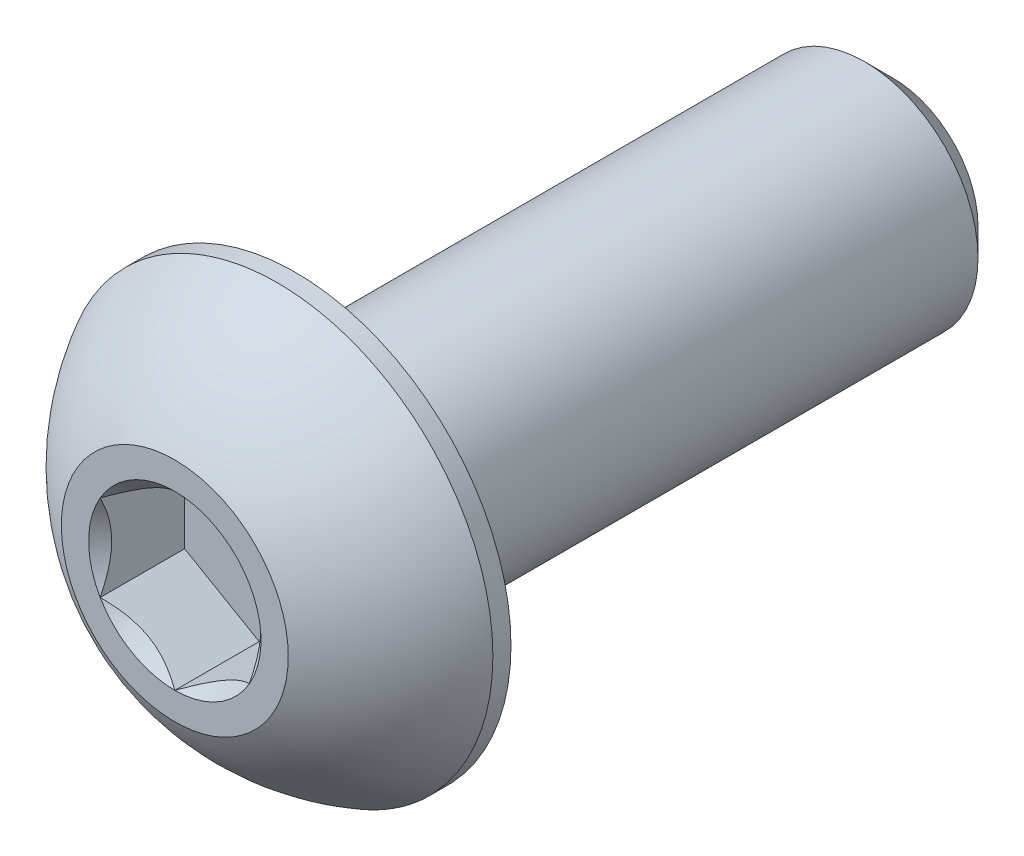
ISO-10303-21;
HEADER;
FILE_DESCRIPTION(('STEP AP214'),'2;1');
FILE_NAME('part.step','',(''),(''),'','','');
FILE_SCHEMA(('AUTOMOTIVE_DESIGN { 1 0 10303 214 1 1 1 1 }'));
ENDSEC;
DATA;
#1=APPLICATION_CONTEXT('core data for automotive mechanical design processes');
#2=APPLICATION_PROTOCOL_DEFINITION('international standard','automotive_design',2000,#1);
#3=PRODUCT_CONTEXT('',#1,'mechanical');
#4=PRODUCT('Part','Part','',(#3));
#5=PRODUCT_RELATED_PRODUCT_CATEGORY('part','',(#4));
#6=PRODUCT_DEFINITION_FORMATION('','',#4);
#7=PRODUCT_DEFINITION_CONTEXT('part definition',#1,'design');
#8=PRODUCT_DEFINITION('design','',#6,#7);
#9=PRODUCT_DEFINITION_SHAPE('','',#8);
#10=(LENGTH_UNIT() NAMED_UNIT(*) SI_UNIT(.MILLI.,.METRE.));
#11=(NAMED_UNIT(*) PLANE_ANGLE_UNIT() SI_UNIT($,.RADIAN.));
#12=(NAMED_UNIT(*) SI_UNIT($,.STERADIAN.) SOLID_ANGLE_UNIT());
#13=UNCERTAINTY_MEASURE_WITH_UNIT(LENGTH_MEASURE(1.E-05),#10,'distance_accuracy_value','');
#14=(GEOMETRIC_REPRESENTATION_CONTEXT(3) GLOBAL_UNCERTAINTY_ASSIGNED_CONTEXT((#13)) GLOBAL_UNIT_ASSIGNED_CONTEXT((#10,
#11,#12)) REPRESENTATION_CONTEXT('',''));
#15=CARTESIAN_POINT('',(0.,0.,0.));
#16=DIRECTION('',(0.,0.,1.));
#17=DIRECTION('',(1.,0.,0.));
#18=AXIS2_PLACEMENT_3D('',#15,#16,#17);
#19=CARTESIAN_POINT('',(1.5875,-0.91654355233853,-1.79578));
#20=DIRECTION('',(1.,0.,0.));
#21=DIRECTION('',(0.,0.,-1.));
#22=AXIS2_PLACEMENT_3D('',#19,#20,#21);
#23=PLANE('',#22);
#24=CARTESIAN_POINT('',(1.5875,0.916543552350696,-4.5148160186422E-11));
#25=CARTESIAN_POINT('',(1.5875,0.853951042749501,-0.0312670531094748));
#26=CARTESIAN_POINT('',(1.5875,0.790318655182352,-0.0607084185325689));
#27=CARTESIAN_POINT('',(1.5875,0.660541633657406,-0.114675036009975));
#28=CARTESIAN_POINT('',(1.5875,0.594383506068262,-0.139167551527056));
#29=CARTESIAN_POINT('',(1.5875,0.460155167710008,-0.181460861757153));
#30=CARTESIAN_POINT('',(1.5875,0.392092287368856,-0.199284303379211));
#31=CARTESIAN_POINT('',(1.5875,0.25447447299835,-0.226724262258425));
#32=CARTESIAN_POINT('',(1.5875,0.184924844084941,-0.23636615820705));
#33=CARTESIAN_POINT('',(1.5875,0.0959348173027102,-0.242807117936028));
#34=CARTESIAN_POINT('',(1.5875,0.0767574755188691,-0.243848419588411));
#35=CARTESIAN_POINT('',(1.5875,0.0383876515905482,-0.245238539012701));
#36=CARTESIAN_POINT('',(1.5875,0.0191951833459475,-0.245587732962164));
#37=CARTESIAN_POINT('',(1.5875,-0.04817613738867,-0.245585527984756));
#38=CARTESIAN_POINT('',(1.5875,-0.0963693775085044,-0.243380381653055));
#39=CARTESIAN_POINT('',(1.5875,-0.19237997675968,-0.234690759054081));
#40=CARTESIAN_POINT('',(1.5875,-0.240197050167174,-0.22820329805671));
#41=CARTESIAN_POINT('',(1.5875,-0.383011002180377,-0.202723016482505));
#42=CARTESIAN_POINT('',(1.5875,-0.476967063071653,-0.177716619167796));
#43=CARTESIAN_POINT('',(1.5875,-0.628737189875188,-0.12655997132136));
#44=CARTESIAN_POINT('',(1.5875,-0.687787687831008,-0.103812337902688));
#45=CARTESIAN_POINT('',(1.5875,-0.80365276412062,-0.0545108768258671));
#46=CARTESIAN_POINT('',(1.5875,-0.860482853236759,-0.0279937656188529));
#47=CARTESIAN_POINT('',(1.5875,-0.916543552350696,-4.51483131680501E-11));
#48=B_SPLINE_CURVE_WITH_KNOTS('',3,(#24,#25,#26,#27,#28,#29,#30,#31,#32,#33,#34,#35,#36,#37,#38,
#39,#40,#41,#42,#43,#44,#45,#46,#47),.UNSPECIFIED.,.F.,.F.,(4,2,2,2,2,2,2,2,2,2,2,4),(0.,
0.210047204138571,0.421441388615704,0.632111059443719,0.842124830787817,0.899732953406839,
0.957309755998791,1.10181621379492,1.246423497634,1.53683268063418,1.72655304070107,
1.91453812064177),.UNSPECIFIED.);
#49=CARTESIAN_POINT('',(1.58750000000041,0.916543552338296,-5.09958482129803E-11));
#50=VERTEX_POINT('',#49);
#51=CARTESIAN_POINT('',(1.58750000000527,-0.916543552341572,-4.51486722899349E-11));
#52=VERTEX_POINT('',#51);
#53=EDGE_CURVE('E21',#50,#52,#48,.T.);
#54=ORIENTED_EDGE('',*,*,#53,.F.);
#55=DIRECTION('',(0.,0.,1.));
#56=VECTOR('',#55,1.);
#57=CARTESIAN_POINT('',(1.5875,0.916543552338531,-1.79578));
#58=LINE('',#57,#56);
#59=CARTESIAN_POINT('',(1.5875,0.916543552338531,-1.79578));
#60=VERTEX_POINT('',#59);
#61=EDGE_CURVE('E69',#50,#60,#58,.F.);
#62=ORIENTED_EDGE('',*,*,#61,.T.);
#63=DIRECTION('',(0.,1.,0.));
#64=VECTOR('',#63,1.);
#65=CARTESIAN_POINT('',(1.5875,-0.91654355233853,-1.79578));
#66=LINE('',#65,#64);
#67=CARTESIAN_POINT('',(1.5875,-0.91654355233853,-1.79578));
#68=VERTEX_POINT('',#67);
#69=EDGE_CURVE('E75',#68,#60,#66,.T.);
#70=ORIENTED_EDGE('',*,*,#69,.F.);
#71=DIRECTION('',(0.,0.,1.));
#72=VECTOR('',#71,1.);
#73=CARTESIAN_POINT('',(1.5875,-0.91654355233853,-1.79578));
#74=LINE('',#73,#72);
#75=EDGE_CURVE('E72',#68,#52,#74,.T.);
#76=ORIENTED_EDGE('',*,*,#75,.T.);
#77=EDGE_LOOP('',(#54,#62,#70,#76));
#78=FACE_BOUND('',#77,.T.);
#79=ADVANCED_FACE('F17',(#78),#23,.F.);
#80=CARTESIAN_POINT('',(1.5875,-0.91654355233853,-1.79578));
#81=DIRECTION('',(0.,0.,1.));
#82=DIRECTION('',(1.,0.,0.));
#83=AXIS2_PLACEMENT_3D('',#80,#81,#82);
#84=PLANE('',#83);
#85=DIRECTION('',(0.,-1.,0.));
#86=VECTOR('',#85,1.);
#87=CARTESIAN_POINT('',(-1.5875,0.916543552338531,-1.79578));
#88=LINE('',#87,#86);
#89=CARTESIAN_POINT('',(-1.5875,0.91654355233853,-1.79578));
#90=VERTEX_POINT('',#89);
#91=CARTESIAN_POINT('',(-1.5875,-0.916543552338531,-1.79578));
#92=VERTEX_POINT('',#91);
#93=EDGE_CURVE('E218',#90,#92,#88,.T.);
#94=ORIENTED_EDGE('',*,*,#93,.T.);
#95=DIRECTION('',(0.866025403784439,-0.5,0.));
#96=VECTOR('',#95,1.);
#97=CARTESIAN_POINT('',(-1.5875,-0.916543552338531,-1.79578));
#98=LINE('',#97,#96);
#99=CARTESIAN_POINT('',(0.,-1.83308710467706,-1.79578));
#100=VERTEX_POINT('',#99);
#101=EDGE_CURVE('E244',#92,#100,#98,.T.);
#102=ORIENTED_EDGE('',*,*,#101,.T.);
#103=DIRECTION('',(0.866025403784438,0.5,0.));
#104=VECTOR('',#103,1.);
#105=CARTESIAN_POINT('',(0.,-1.83308710467706,-1.79578));
#106=LINE('',#105,#104);
#107=EDGE_CURVE('E233',#100,#68,#106,.T.);
#108=ORIENTED_EDGE('',*,*,#107,.T.);
#109=ORIENTED_EDGE('',*,*,#69,.T.);
#110=DIRECTION('',(-0.866025403784439,0.5,0.));
#111=VECTOR('',#110,1.);
#112=CARTESIAN_POINT('',(1.5875,0.916543552338531,-1.79578));
#113=LINE('',#112,#111);
#114=CARTESIAN_POINT('',(0.,1.83308710467706,-1.79578));
#115=VERTEX_POINT('',#114);
#116=EDGE_CURVE('E82',#60,#115,#113,.T.);
#117=ORIENTED_EDGE('',*,*,#116,.T.);
#118=DIRECTION('',(-0.866025403784438,-0.5,0.));
#119=VECTOR('',#118,1.);
#120=CARTESIAN_POINT('',(0.,1.83308710467706,-1.79578));
#121=LINE('',#120,#119);
#122=EDGE_CURVE('E83',#115,#90,#121,.T.);
#123=ORIENTED_EDGE('',*,*,#122,.T.);
#124=EDGE_LOOP('',(#94,#102,#108,#109,#117,#123));
#125=FACE_BOUND('',#124,.T.);
#126=ADVANCED_FACE('F162',(#125),#84,.T.);
#127=CARTESIAN_POINT('',(-1.5875,-0.916543552338531,-1.79578));
#128=DIRECTION('',(-0.5,-0.866025403784439,0.));
#129=DIRECTION('',(0.866025403784439,-0.5,0.));
#130=AXIS2_PLACEMENT_3D('',#127,#128,#129);
#131=PLANE('',#130);
#132=CARTESIAN_POINT('',(-1.58750000000813,-0.916543552333836,-4.65365177804234E-11));
#133=CARTESIAN_POINT('',(-1.53293684973442,-0.948045601832198,-0.0314718176892667));
#134=CARTESIAN_POINT('',(-1.47746140241271,-0.980074366276803,-0.0610949372672066));
#135=CARTESIAN_POINT('',(-1.36434127230903,-1.04538430384293,-0.115333604591992));
#136=CARTESIAN_POINT('',(-1.30668583767504,-1.07867168454911,-0.139918983823398));
#137=CARTESIAN_POINT('',(-1.1904264819008,-1.14579405490118,-0.18203390392943));
#138=CARTESIAN_POINT('',(-1.13185215255292,-1.17961195971778,-0.199669270496182));
#139=CARTESIAN_POINT('',(-1.01341433779326,-1.2479920639515,-0.226839911359059));
#140=CARTESIAN_POINT('',(-0.95355446788638,-1.28255217595589,-0.236395459908957));
#141=CARTESIAN_POINT('',(-0.850383225835588,-1.34211812032654,-0.245017258142065));
#142=CARTESIAN_POINT('',(-0.807205047661772,-1.36704705311831,-0.24629317825213));
#143=CARTESIAN_POINT('',(-0.720919334101995,-1.41686413306927,-0.244140862172588));
#144=CARTESIAN_POINT('',(-0.677811828778317,-1.44175226287199,-0.240710977134276));
#145=CARTESIAN_POINT('',(-0.592014799905288,-1.4912872005875,-0.22934368581992));
#146=CARTESIAN_POINT('',(-0.54932567052745,-1.51593378092527,-0.2214023797855));
#147=CARTESIAN_POINT('',(-0.464663949078726,-1.56481324859374,-0.2014437231592));
#148=CARTESIAN_POINT('',(-0.422691672575671,-1.58904595373128,-0.189424623694276));
#149=CARTESIAN_POINT('',(-0.315224720340997,-1.65109202753296,-0.153756168099754));
#150=CARTESIAN_POINT('',(-0.25039544383198,-1.68852122777681,-0.127422292452885));
#151=CARTESIAN_POINT('',(-0.155071115632602,-1.74355675432304,-0.0829693854516809));
#152=CARTESIAN_POINT('',(-0.12365879001164,-1.76169266897618,-0.0673516407383855));
#153=CARTESIAN_POINT('',(-0.0614115175424615,-1.79763114849258,-0.0346905494690997));
#154=CARTESIAN_POINT('',(-0.0305763044110986,-1.81543386709449,-0.0176478812714443));
#155=CARTESIAN_POINT('',(8.13171000505997E-12,-1.83308710468176,-4.65365727835881E-11));
#156=B_SPLINE_CURVE_WITH_KNOTS('',3,(#132,#133,#134,#135,#136,#137,#138,#139,#140,#141,#142,
#143,#144,#145,#146,#147,#148,#149,#150,#151,#152,#153,#154,#155),.UNSPECIFIED.,.F.,.F.,(4,2,2,
2,2,2,2,2,2,2,2,4),(0.,0.211427927731364,0.424087197146833,0.633370156420732,0.842126401513702,
0.991537201097076,1.14100036551936,1.29059292577182,1.44024972414901,1.67781721416321,
1.79627069410093,1.91466809994021),.UNSPECIFIED.);
#157=CARTESIAN_POINT('',(-1.58750000000164,-0.91654355233478,-5.16899840796238E-11));
#158=VERTEX_POINT('',#157);
#159=CARTESIAN_POINT('',(7.95488278334753E-13,-1.8330871046766,-5.1689793188624E-11));
#160=VERTEX_POINT('',#159);
#161=EDGE_CURVE('E164',#158,#160,#156,.T.);
#162=ORIENTED_EDGE('',*,*,#161,.T.);
#163=DIRECTION('',(0.,0.,1.));
#164=VECTOR('',#163,1.);
#165=CARTESIAN_POINT('',(0.,-1.83308710467706,-1.79578));
#166=LINE('',#165,#164);
#167=EDGE_CURVE('E227',#160,#100,#166,.F.);
#168=ORIENTED_EDGE('',*,*,#167,.T.);
#169=ORIENTED_EDGE('',*,*,#101,.F.);
#170=DIRECTION('',(0.,0.,1.));
#171=VECTOR('',#170,1.);
#172=CARTESIAN_POINT('',(-1.5875,-0.916543552338531,-1.79578));
#173=LINE('',#172,#171);
#174=EDGE_CURVE('E214',#92,#158,#173,.T.);
#175=ORIENTED_EDGE('',*,*,#174,.T.);
#176=EDGE_LOOP('',(#162,#168,#169,#175));
#177=FACE_BOUND('',#176,.T.);
#178=ADVANCED_FACE('F158',(#177),#131,.F.);
#179=CARTESIAN_POINT('',(0.,-1.83308710467706,-1.79578));
#180=DIRECTION('',(0.5,-0.866025403784438,0.));
#181=DIRECTION('',(0.866025403784438,0.5,0.));
#182=AXIS2_PLACEMENT_3D('',#179,#180,#181);
#183=PLANE('',#182);
#184=CARTESIAN_POINT('',(-8.13084748350422E-12,-1.83308710468176,-4.65361675164433E-11));
#185=CARTESIAN_POINT('',(0.0545631502655831,-1.80158505518339,-0.0314718176892672));
#186=CARTESIAN_POINT('',(0.110038597587296,-1.76955629073879,-0.0610949372672078));
#187=CARTESIAN_POINT('',(0.22315872769098,-1.70424635317266,-0.115333604591995));
#188=CARTESIAN_POINT('',(0.280814162324968,-1.67095897246648,-0.1399189838234));
#189=CARTESIAN_POINT('',(0.397073518099212,-1.60383660211441,-0.182033903929432));
#190=CARTESIAN_POINT('',(0.455647847447088,-1.57001869729781,-0.199669270496184));
#191=CARTESIAN_POINT('',(0.574085662206744,-1.50163859306409,-0.226839911359059));
#192=CARTESIAN_POINT('',(0.633945532113621,-1.4670784810597,-0.236395459908957));
#193=CARTESIAN_POINT('',(0.737116774164411,-1.40751253668905,-0.245017258142065));
#194=CARTESIAN_POINT('',(0.780294952338226,-1.38258360389728,-0.24629317825213));
#195=CARTESIAN_POINT('',(0.866580665898003,-1.33276652394632,-0.244140862172588));
#196=CARTESIAN_POINT('',(0.90968817122168,-1.30787839414361,-0.240710977134277));
#197=CARTESIAN_POINT('',(0.995485200094709,-1.25834345642809,-0.229343685819921));
#198=CARTESIAN_POINT('',(1.03817432947255,-1.23369687609033,-0.2214023797855));
#199=CARTESIAN_POINT('',(1.12283605092127,-1.18481740842185,-0.2014437231592));
#200=CARTESIAN_POINT('',(1.16480832742433,-1.16058470328431,-0.189424623694276));
#201=CARTESIAN_POINT('',(1.27227527965931,-1.09853862948245,-0.153756168099651));
#202=CARTESIAN_POINT('',(1.33710455616863,-1.06110942923843,-0.127422292452638));
#203=CARTESIAN_POINT('',(1.43242888436844,-1.00607390269195,-0.0829693854511779));
#204=CARTESIAN_POINT('',(1.46384120998954,-0.987937988038733,-0.0673516407377908));
#205=CARTESIAN_POINT('',(1.52608848245899,-0.951999508522174,-0.0346905494683118));
#206=CARTESIAN_POINT('',(1.55692369559049,-0.934196789920184,-0.0176478812705549));
#207=CARTESIAN_POINT('',(1.58750000000985,-0.916543552332841,-4.55419445064032E-11));
#208=B_SPLINE_CURVE_WITH_KNOTS('',3,(#184,#185,#186,#187,#188,#189,#190,#191,#192,#193,#194,
#195,#196,#197,#198,#199,#200,#201,#202,#203,#204,#205,#206,#207),.UNSPECIFIED.,.F.,.F.,(4,2,2,
2,2,2,2,2,2,2,2,4),(0.,0.211427927731369,0.424087197146844,0.633370156420738,0.842126401513702,
0.991537201097074,1.14100036551936,1.29059292577182,1.44024972414901,1.67781721416432,
1.7962706941026,1.91466809994243),.UNSPECIFIED.);
#209=EDGE_CURVE('E92',#160,#52,#208,.T.);
#210=ORIENTED_EDGE('',*,*,#209,.T.);
#211=ORIENTED_EDGE('',*,*,#75,.F.);
#212=ORIENTED_EDGE('',*,*,#107,.F.);
#213=ORIENTED_EDGE('',*,*,#167,.F.);
#214=EDGE_LOOP('',(#210,#211,#212,#213));
#215=FACE_BOUND('',#214,.T.);
#216=ADVANCED_FACE('F153',(#215),#183,.F.);
#217=CARTESIAN_POINT('',(1.5875,0.916543552338531,-1.79578));
#218=DIRECTION('',(0.5,0.866025403784439,0.));
#219=DIRECTION('',(-0.866025403784439,0.5,0.));
#220=AXIS2_PLACEMENT_3D('',#217,#218,#219);
#221=PLANE('',#220);
#222=CARTESIAN_POINT('',(1.58750000000388,0.916543552325157,-4.09205335444077E-11));
#223=CARTESIAN_POINT('',(1.53293684973449,0.948045601828149,-0.0314718176863875));
#224=CARTESIAN_POINT('',(1.47746140241465,0.980074366274606,-0.0610949372654595));
#225=CARTESIAN_POINT('',(1.3643412723126,1.04538430384195,-0.1153336045911));
#226=CARTESIAN_POINT('',(1.30668583767836,1.07867168454748,-0.139918983822225));
#227=CARTESIAN_POINT('',(1.19042648190426,1.1457940548989,-0.182033903928146));
#228=CARTESIAN_POINT('',(1.13185215255677,1.17961195971548,-0.199669270495064));
#229=CARTESIAN_POINT('',(1.01341433779771,1.247992063949,-0.226839911358272));
#230=CARTESIAN_POINT('',(0.953554467891033,1.28255217595322,-0.236395459908332));
#231=CARTESIAN_POINT('',(0.85038322584057,1.34211812032365,-0.245017258141818));
#232=CARTESIAN_POINT('',(0.807205047666872,1.36704705311536,-0.246293178252067));
#233=CARTESIAN_POINT('',(0.720919334107315,1.4168641330662,-0.24414086217291));
#234=CARTESIAN_POINT('',(0.677811828783741,1.44175226286886,-0.240710977134801));
#235=CARTESIAN_POINT('',(0.592014799910885,1.49128720058427,-0.229343685820857));
#236=CARTESIAN_POINT('',(0.549325670533118,1.51593378092199,-0.221402379786645));
#237=CARTESIAN_POINT('',(0.464663949084521,1.5648132485904,-0.201443723160757));
#238=CARTESIAN_POINT('',(0.422691672581523,1.58904595372791,-0.189424623696037));
#239=CARTESIAN_POINT('',(0.315224720345838,1.65109202753017,-0.153756168101648));
#240=CARTESIAN_POINT('',(0.250395443835785,1.68852122777462,-0.127422292454545));
#241=CARTESIAN_POINT('',(0.155071115634923,1.7435567543217,-0.0829693854528209));
#242=CARTESIAN_POINT('',(0.123658790013484,1.76169266897511,-0.0673516407393276));
#243=CARTESIAN_POINT('',(0.0614115175433705,1.79763114849205,-0.0346905494696016));
#244=CARTESIAN_POINT('',(0.0305763044115495,1.81543386709423,-0.0176478812717039));
#245=CARTESIAN_POINT('',(-8.13179444088293E-12,1.83308710468176,-4.65362862267458E-11));
#246=B_SPLINE_CURVE_WITH_KNOTS('',3,(#222,#223,#224,#225,#226,#227,#228,#229,#230,#231,#232,
#233,#234,#235,#236,#237,#238,#239,#240,#241,#242,#243,#244,#245),.UNSPECIFIED.,.F.,.F.,(4,2,2,
2,2,2,2,2,2,2,2,4),(0.,0.211427927730897,0.424087197145704,0.633370156418781,0.842126401511014,
0.991537201094014,1.1410003655159,1.29059292576802,1.44024972414487,1.67781721416266,
1.79627069410213,1.91466809994315),.UNSPECIFIED.);
#247=CARTESIAN_POINT('',(-7.95207176848919E-13,1.8330871046766,-5.16898686531374E-11));
#248=VERTEX_POINT('',#247);
#249=EDGE_CURVE('E80',#50,#248,#246,.T.);
#250=ORIENTED_EDGE('',*,*,#249,.T.);
#251=DIRECTION('',(0.,0.,1.));
#252=VECTOR('',#251,1.);
#253=CARTESIAN_POINT('',(0.,1.83308710467706,-1.79578));
#254=LINE('',#253,#252);
#255=EDGE_CURVE('E221',#248,#115,#254,.F.);
#256=ORIENTED_EDGE('',*,*,#255,.T.);
#257=ORIENTED_EDGE('',*,*,#116,.F.);
#258=ORIENTED_EDGE('',*,*,#61,.F.);
#259=EDGE_LOOP('',(#250,#256,#257,#258));
#260=FACE_BOUND('',#259,.T.);
#261=ADVANCED_FACE('F77',(#260),#221,.F.);
#262=CARTESIAN_POINT('',(0.,1.83308710467706,-1.79578));
#263=DIRECTION('',(-0.5,0.866025403784438,0.));
#264=DIRECTION('',(-0.866025403784438,-0.5,0.));
#265=AXIS2_PLACEMENT_3D('',#262,#263,#264);
#266=PLANE('',#265);
#267=CARTESIAN_POINT('',(8.13097600560689E-12,1.83308710468176,-4.65363184454702E-11));
#268=CARTESIAN_POINT('',(-0.0545631502655815,1.80158505518339,-0.0314718176892664));
#269=CARTESIAN_POINT('',(-0.110038597587293,1.76955629073879,-0.0610949372672063));
#270=CARTESIAN_POINT('',(-0.223158727690974,1.70424635317266,-0.115333604591992));
#271=CARTESIAN_POINT('',(-0.280814162324961,1.67095897246649,-0.139918983823398));
#272=CARTESIAN_POINT('',(-0.397073518099204,1.60383660211441,-0.18203390392943));
#273=CARTESIAN_POINT('',(-0.455647847447081,1.57001869729782,-0.199669270496182));
#274=CARTESIAN_POINT('',(-0.574085662206741,1.50163859306409,-0.226839911359059));
#275=CARTESIAN_POINT('',(-0.63394553211362,1.4670784810597,-0.236395459908958));
#276=CARTESIAN_POINT('',(-0.737116774164412,1.40751253668905,-0.245017258142065));
#277=CARTESIAN_POINT('',(-0.780294952338228,1.38258360389728,-0.24629317825213));
#278=CARTESIAN_POINT('',(-0.866580665898006,1.33276652394632,-0.244140862172588));
#279=CARTESIAN_POINT('',(-0.909688171221683,1.3078783941436,-0.240710977134277));
#280=CARTESIAN_POINT('',(-0.995485200094712,1.25834345642809,-0.22934368581992));
#281=CARTESIAN_POINT('',(-1.03817432947255,1.23369687609032,-0.2214023797855));
#282=CARTESIAN_POINT('',(-1.12283605092128,1.18481740842185,-0.2014437231592));
#283=CARTESIAN_POINT('',(-1.16480832742433,1.16058470328431,-0.189424623694275));
#284=CARTESIAN_POINT('',(-1.272275279659,1.09853862948263,-0.153756168099754));
#285=CARTESIAN_POINT('',(-1.33710455616802,1.06110942923878,-0.127422292452885));
#286=CARTESIAN_POINT('',(-1.4324288843674,1.00607390269255,-0.082969385451681));
#287=CARTESIAN_POINT('',(-1.46384120998836,0.987937988039414,-0.0673516407383855));
#288=CARTESIAN_POINT('',(-1.52608848245754,0.951999508523014,-0.0346905494690997));
#289=CARTESIAN_POINT('',(-1.5569236955889,0.934196789921102,-0.0176478812714444));
#290=CARTESIAN_POINT('',(-1.58750000000813,0.916543552333835,-4.65368165514551E-11));
#291=B_SPLINE_CURVE_WITH_KNOTS('',3,(#267,#268,#269,#270,#271,#272,#273,#274,#275,#276,#277,
#278,#279,#280,#281,#282,#283,#284,#285,#286,#287,#288,#289,#290),.UNSPECIFIED.,.F.,.F.,(4,2,2,
2,2,2,2,2,2,2,2,4),(0.,0.211427927731364,0.424087197146833,0.633370156420733,0.842126401513703,
0.991537201097077,1.14100036551936,1.29059292577183,1.44024972414901,1.67781721416321,
1.79627069410093,1.91466809994021),.UNSPECIFIED.);
#292=CARTESIAN_POINT('',(-1.5875,0.916543552337613,-5.16898734477398E-11));
#293=VERTEX_POINT('',#292);
#294=EDGE_CURVE('E40',#248,#293,#291,.T.);
#295=ORIENTED_EDGE('',*,*,#294,.T.);
#296=DIRECTION('',(0.,0.,1.));
#297=VECTOR('',#296,1.);
#298=CARTESIAN_POINT('',(-1.5875,0.916543552338531,-1.79578));
#299=LINE('',#298,#297);
#300=EDGE_CURVE('E168',#293,#90,#299,.F.);
#301=ORIENTED_EDGE('',*,*,#300,.T.);
#302=ORIENTED_EDGE('',*,*,#122,.F.);
#303=ORIENTED_EDGE('',*,*,#255,.F.);
#304=EDGE_LOOP('',(#295,#301,#302,#303));
#305=FACE_BOUND('',#304,.T.);
#306=ADVANCED_FACE('F152',(#305),#266,.F.);
#307=CARTESIAN_POINT('',(-1.5875,0.916543552338531,-1.79578));
#308=DIRECTION('',(-1.,0.,0.));
#309=DIRECTION('',(0.,-1.,0.));
#310=AXIS2_PLACEMENT_3D('',#307,#308,#309);
#311=PLANE('',#310);
#312=CARTESIAN_POINT('',(-1.5875,0.91654355234792,-4.65364617736849E-11));
#313=CARTESIAN_POINT('',(-1.5875,0.853539453351184,-0.0314718176892656));
#314=CARTESIAN_POINT('',(-1.5875,0.789481924461962,-0.0610949372672041));
#315=CARTESIAN_POINT('',(-1.5875,0.658862049329686,-0.115333604591986));
#316=CARTESIAN_POINT('',(-1.5875,0.59228728791732,-0.139918983823388));
#317=CARTESIAN_POINT('',(-1.5875,0.458042547213152,-0.182033903929413));
#318=CARTESIAN_POINT('',(-1.5875,0.390406737579943,-0.199669270496161));
#319=CARTESIAN_POINT('',(-1.5875,0.25364652911248,-0.226839911359028));
#320=CARTESIAN_POINT('',(-1.5875,0.184526305103684,-0.23639545990892));
#321=CARTESIAN_POINT('',(-1.5875,0.0653944163623529,-0.245017258142017));
#322=CARTESIAN_POINT('',(-1.5875,0.0155365507787979,-0.246293178252077));
#323=CARTESIAN_POINT('',(-1.5875,-0.0840976091231443,-0.244140862172523));
#324=CARTESIAN_POINT('',(-1.5875,-0.133873868728595,-0.240710977134206));
#325=CARTESIAN_POINT('',(-1.5875,-0.23294374415965,-0.229343685819835));
#326=CARTESIAN_POINT('',(-1.5875,-0.282236904835194,-0.221402379785407));
#327=CARTESIAN_POINT('',(-1.5875,-0.379995840172177,-0.20144372315909));
#328=CARTESIAN_POINT('',(-1.5875,-0.42846125044727,-0.189424623694157));
#329=CARTESIAN_POINT('',(-1.5875,-0.552553398050583,-0.153756168099635));
#330=CARTESIAN_POINT('',(-1.5875,-0.627411798538228,-0.127422292452783));
#331=CARTESIAN_POINT('',(-1.5875,-0.737482851630614,-0.0829693854516115));
#332=CARTESIAN_POINT('',(-1.5875,-0.773754680936858,-0.0673516407383284));
#333=CARTESIAN_POINT('',(-1.5875,-0.84563163996961,-0.0346905494690696));
#334=CARTESIAN_POINT('',(-1.5875,-0.88123707717341,-0.0176478812714289));
#335=CARTESIAN_POINT('',(-1.5875,-0.91654355234792,-4.65367892631301E-11));
#336=B_SPLINE_CURVE_WITH_KNOTS('',3,(#312,#313,#314,#315,#316,#317,#318,#319,#320,#321,#322,
#323,#324,#325,#326,#327,#328,#329,#330,#331,#332,#333,#334,#335),.UNSPECIFIED.,.F.,.F.,(4,2,2,
2,2,2,2,2,2,2,2,4),(0.,0.211427927731395,0.424087197146896,0.633370156420825,0.842126401513825,
0.991537201097242,1.14100036551957,1.29059292577208,1.44024972414931,1.67781721416334,
1.79627069410098,1.91466809994017),.UNSPECIFIED.);
#337=EDGE_CURVE('E109',#293,#158,#336,.T.);
#338=ORIENTED_EDGE('',*,*,#337,.T.);
#339=ORIENTED_EDGE('',*,*,#174,.F.);
#340=ORIENTED_EDGE('',*,*,#93,.F.);
#341=ORIENTED_EDGE('',*,*,#300,.F.);
#342=EDGE_LOOP('',(#338,#339,#340,#341));
#343=FACE_BOUND('',#342,.T.);
#344=ADVANCED_FACE('F122',(#343),#311,.F.);
#345=CARTESIAN_POINT('',(0.,0.,-5.6843418860808E-11));
#346=DIRECTION('',(0.,0.,1.));
#347=DIRECTION('',(1.,0.,0.));
#348=AXIS2_PLACEMENT_3D('',#345,#346,#347);
#349=CONICAL_SURFACE('',#348,1.83308710467145,0.78539816351237);
#350=ORIENTED_EDGE('',*,*,#161,.F.);
#351=CARTESIAN_POINT('',(0.,0.,-5.6843418860808E-11));
#352=DIRECTION('',(0.,0.,1.));
#353=DIRECTION('',(1.,0.,0.));
#354=AXIS2_PLACEMENT_3D('',#351,#352,#353);
#355=CIRCLE('',#354,1.83308710467145);
#356=EDGE_CURVE('E106',#158,#160,#355,.T.);
#357=ORIENTED_EDGE('',*,*,#356,.T.);
#358=EDGE_LOOP('',(#350,#357));
#359=FACE_BOUND('',#358,.T.);
#360=ADVANCED_FACE('F169',(#359),#349,.F.);
#361=CARTESIAN_POINT('',(0.,0.,-5.6843418860808E-11));
#362=DIRECTION('',(0.,0.,1.));
#363=DIRECTION('',(1.,0.,0.));
#364=AXIS2_PLACEMENT_3D('',#361,#362,#363);
#365=CONICAL_SURFACE('',#364,1.83308710467145,0.78539816351237);
#366=ORIENTED_EDGE('',*,*,#209,.F.);
#367=CARTESIAN_POINT('',(0.,0.,-5.6843418860808E-11));
#368=DIRECTION('',(0.,0.,1.));
#369=DIRECTION('',(1.,0.,0.));
#370=AXIS2_PLACEMENT_3D('',#367,#368,#369);
#371=CIRCLE('',#370,1.83308710467145);
#372=EDGE_CURVE('E87',#160,#52,#371,.T.);
#373=ORIENTED_EDGE('',*,*,#372,.T.);
#374=EDGE_LOOP('',(#366,#373));
#375=FACE_BOUND('',#374,.T.);
#376=ADVANCED_FACE('F172',(#375),#365,.F.);
#377=CARTESIAN_POINT('',(0.,0.,-5.6843418860808E-11));
#378=DIRECTION('',(0.,0.,1.));
#379=DIRECTION('',(1.,0.,0.));
#380=AXIS2_PLACEMENT_3D('',#377,#378,#379);
#381=CONICAL_SURFACE('',#380,1.83308710467145,0.785398163397448);
#382=CARTESIAN_POINT('',(0.,0.,-5.6843418860808E-11));
#383=DIRECTION('',(0.,0.,1.));
#384=DIRECTION('',(1.,0.,0.));
#385=AXIS2_PLACEMENT_3D('',#382,#383,#384);
#386=CIRCLE('',#385,1.83308710467145);
#387=EDGE_CURVE('E60',#52,#50,#386,.T.);
#388=ORIENTED_EDGE('',*,*,#387,.T.);
#389=ORIENTED_EDGE('',*,*,#53,.T.);
#390=EDGE_LOOP('',(#388,#389));
#391=FACE_BOUND('',#390,.T.);
#392=ADVANCED_FACE('F85',(#391),#381,.F.);
#393=CARTESIAN_POINT('',(0.,0.,-5.6843418860808E-11));
#394=DIRECTION('',(0.,0.,1.));
#395=DIRECTION('',(1.,0.,0.));
#396=AXIS2_PLACEMENT_3D('',#393,#394,#395);
#397=CONICAL_SURFACE('',#396,1.83308710467145,0.78539816351237);
#398=ORIENTED_EDGE('',*,*,#249,.F.);
#399=CARTESIAN_POINT('',(0.,0.,-5.6843418860808E-11));
#400=DIRECTION('',(0.,0.,1.));
#401=DIRECTION('',(1.,0.,0.));
#402=AXIS2_PLACEMENT_3D('',#399,#400,#401);
#403=CIRCLE('',#402,1.83308710467145);
#404=EDGE_CURVE('E86',#50,#248,#403,.T.);
#405=ORIENTED_EDGE('',*,*,#404,.T.);
#406=EDGE_LOOP('',(#398,#405));
#407=FACE_BOUND('',#406,.T.);
#408=ADVANCED_FACE('F91',(#407),#397,.F.);
#409=CARTESIAN_POINT('',(0.,0.,-5.6843418860808E-11));
#410=DIRECTION('',(0.,0.,1.));
#411=DIRECTION('',(1.,0.,0.));
#412=AXIS2_PLACEMENT_3D('',#409,#410,#411);
#413=CONICAL_SURFACE('',#412,1.83308710467145,0.78539816351237);
#414=ORIENTED_EDGE('',*,*,#294,.F.);
#415=CARTESIAN_POINT('',(0.,0.,-5.68432020203736E-11));
#416=DIRECTION('',(0.,0.,1.));
#417=DIRECTION('',(1.,0.,0.));
#418=AXIS2_PLACEMENT_3D('',#415,#416,#417);
#419=CIRCLE('',#418,1.83308710467145);
#420=EDGE_CURVE('E98',#248,#293,#419,.T.);
#421=ORIENTED_EDGE('',*,*,#420,.T.);
#422=EDGE_LOOP('',(#414,#421));
#423=FACE_BOUND('',#422,.T.);
#424=ADVANCED_FACE('F129',(#423),#413,.F.);
#425=CARTESIAN_POINT('',(0.,0.,-5.6843418860808E-11));
#426=DIRECTION('',(0.,0.,1.));
#427=DIRECTION('',(1.,0.,0.));
#428=AXIS2_PLACEMENT_3D('',#425,#426,#427);
#429=CONICAL_SURFACE('',#428,1.83308710467145,0.785398163512482);
#430=ORIENTED_EDGE('',*,*,#337,.F.);
#431=CARTESIAN_POINT('',(0.,0.,-5.6843418860808E-11));
#432=DIRECTION('',(0.,0.,1.));
#433=DIRECTION('',(1.,0.,0.));
#434=AXIS2_PLACEMENT_3D('',#431,#432,#433);
#435=CIRCLE('',#434,1.83308710467145);
#436=EDGE_CURVE('E100',#293,#158,#435,.T.);
#437=ORIENTED_EDGE('',*,*,#436,.T.);
#438=EDGE_LOOP('',(#430,#437));
#439=FACE_BOUND('',#438,.T.);
#440=ADVANCED_FACE('F125',(#439),#429,.F.);
#441=CARTESIAN_POINT('',(0.,-2.413,0.));
#442=DIRECTION('',(0.,0.,-1.));
#443=DIRECTION('',(-1.,0.,0.));
#444=AXIS2_PLACEMENT_3D('',#441,#442,#443);
#445=PLANE('',#444);
#446=CARTESIAN_POINT('',(0.,2.41300000000001,0.));
#447=CARTESIAN_POINT('',(0.0677494728281043,2.41299959399955,0.));
#448=CARTESIAN_POINT('',(0.13551139645195,2.41014415989588,0.));
#449=CARTESIAN_POINT('',(0.270566967352935,2.39874098782787,0.));
#450=CARTESIAN_POINT('',(0.337860470451762,2.39019156931712,-1.27847024027233E-13));
#451=CARTESIAN_POINT('',(0.471601320639727,2.36743889257111,1.28918507901389E-13));
#452=CARTESIAN_POINT('',(0.538047150928301,2.35322665951012,4.80959012476224E-13));
#453=CARTESIAN_POINT('',(0.669542290683469,2.31924632100677,-4.80482413021759E-13));
#454=CARTESIAN_POINT('',(0.734590420561955,2.29947370693801,-1.79531897556432E-12));
#455=CARTESIAN_POINT('',(0.926662950450337,2.23208866037698,-3.22584967757263E-12));
#456=CARTESIAN_POINT('',(1.05093873255639,2.17635367452114,-8.45786465533834E-13));
#457=CARTESIAN_POINT('',(1.28835543096987,2.04478110377478,8.46685999083916E-13));
#458=CARTESIAN_POINT('',(1.40149592376953,1.96894275469913,1.58978621376691E-13));
#459=CARTESIAN_POINT('',(1.56039704916752,1.84183425468125,0.));
#460=CARTESIAN_POINT('',(1.61159242186082,1.79720603297069,0.));
#461=CARTESIAN_POINT('',(1.71000632967643,1.70383063464741,0.));
#462=CARTESIAN_POINT('',(1.75722865147863,1.65508747081338,0.));
#463=CARTESIAN_POINT('',(1.84741983372678,1.55377296533884,0.));
#464=CARTESIAN_POINT('',(1.89038675770033,1.50119989956805,0.));
#465=CARTESIAN_POINT('',(1.97174331906875,1.3926258162236,0.));
#466=CARTESIAN_POINT('',(2.01013189400735,1.33662400751775,0.));
#467=CARTESIAN_POINT('',(2.11797602264298,1.16408610688379,0.));
#468=CARTESIAN_POINT('',(2.18020511880695,1.04291047052782,0.));
#469=CARTESIAN_POINT('',(2.28339851019844,0.791897051410366,0.));
#470=CARTESIAN_POINT('',(2.32436303254154,0.66205936118038,0.));
#471=CARTESIAN_POINT('',(2.38392374490441,0.397332738666662,0.));
#472=CARTESIAN_POINT('',(2.40251981546714,0.262443779410977,0.));
#473=CARTESIAN_POINT('',(2.41679648401006,-0.00854142496427087,0.));
#474=CARTESIAN_POINT('',(2.41247708199024,-0.144637670083833,0.));
#475=CARTESIAN_POINT('',(2.38106276220064,-0.414157249403837,0.));
#476=CARTESIAN_POINT('',(2.35396796606072,-0.547580597874736,0.));
#477=CARTESIAN_POINT('',(2.27772157192305,-0.808047678299337,0.));
#478=CARTESIAN_POINT('',(2.22856973834409,-0.935091342098402,0.));
#479=CARTESIAN_POINT('',(2.13945238372271,-1.11800602259631,0.));
#480=CARTESIAN_POINT('',(2.10716082445999,-1.17773156541116,0.));
#481=CARTESIAN_POINT('',(2.03766328061094,-1.29425329321649,0.));
#482=CARTESIAN_POINT('',(2.00045843572899,-1.35105015331986,0.));
#483=CARTESIAN_POINT('',(1.92141236423528,-1.46128080675297,0.));
#484=CARTESIAN_POINT('',(1.87957324454218,-1.51471611118972,0.));
#485=CARTESIAN_POINT('',(1.79151575044596,-1.61791562667817,0.));
#486=CARTESIAN_POINT('',(1.74529318867507,-1.66767624505837,0.));
#487=CARTESIAN_POINT('',(1.60062790056994,-1.81077793214477,0.));
#488=CARTESIAN_POINT('',(1.496082606595,-1.89808490671825,0.));
#489=CARTESIAN_POINT('',(1.27380547141758,-2.05387612994836,0.));
#490=CARTESIAN_POINT('',(1.15607413167662,-2.12236109405874,0.));
#491=CARTESIAN_POINT('',(0.972145513690423,-2.20955550169802,0.));
#492=CARTESIAN_POINT('',(0.909535130507399,-2.23605371645848,0.));
#493=CARTESIAN_POINT('',(0.782338486500698,-2.28366305312172,0.));
#494=CARTESIAN_POINT('',(0.717753872487818,-2.30477853474402,0.));
#495=CARTESIAN_POINT('',(0.587144181474127,-2.34145833738057,0.));
#496=CARTESIAN_POINT('',(0.521121555924461,-2.35703142415597,0.));
#497=CARTESIAN_POINT('',(0.38801185086693,-2.38256269878371,0.));
#498=CARTESIAN_POINT('',(0.320925091325935,-2.39252254272931,0.));
#499=CARTESIAN_POINT('',(0.211445294063883,-2.40409104943932,0.));
#500=CARTESIAN_POINT('',(0.16922754124227,-2.40743084866624,0.));
#501=CARTESIAN_POINT('',(0.0846748132034888,-2.41188545081099,0.));
#502=CARTESIAN_POINT('',(0.0423398379863207,-2.41300025372882,0.));
#503=CARTESIAN_POINT('',(-0.0677494728281031,-2.41299959399954,0.));
#504=CARTESIAN_POINT('',(-0.135511396451949,-2.41014415989587,0.));
#505=CARTESIAN_POINT('',(-0.270566967352934,-2.39874098782787,0.));
#506=CARTESIAN_POINT('',(-0.337860470451761,-2.39019156931711,-1.27836024207223E-13));
#507=CARTESIAN_POINT('',(-0.471601320639725,-2.36743889257111,1.28907490578305E-13));
#508=CARTESIAN_POINT('',(-0.538047150928299,-2.35322665951012,4.8098540959153E-13));
#509=CARTESIAN_POINT('',(-0.669542290683467,-2.31924632100677,-4.80508831603149E-13));
#510=CARTESIAN_POINT('',(-0.734590420561954,-2.29947370693801,-1.79543572810586E-12));
#511=CARTESIAN_POINT('',(-0.926662950450336,-2.23208866037698,-3.22561672903511E-12));
#512=CARTESIAN_POINT('',(-1.05093873255638,-2.17635367452113,-8.44496166373919E-13));
#513=CARTESIAN_POINT('',(-1.28835543096987,-2.04478110377478,8.45395650869079E-13));
#514=CARTESIAN_POINT('',(-1.40149592376953,-1.96894275469912,1.54050096654222E-13));
#515=CARTESIAN_POINT('',(-1.56039704916752,-1.84183425468125,0.));
#516=CARTESIAN_POINT('',(-1.61159242186081,-1.79720603297069,0.));
#517=CARTESIAN_POINT('',(-1.71000632967643,-1.70383063464741,0.));
#518=CARTESIAN_POINT('',(-1.75722865147862,-1.65508747081338,0.));
#519=CARTESIAN_POINT('',(-1.84741983372678,-1.55377296533883,0.));
#520=CARTESIAN_POINT('',(-1.89038675770033,-1.50119989956804,0.));
#521=CARTESIAN_POINT('',(-1.97174331906875,-1.3926258162236,0.));
#522=CARTESIAN_POINT('',(-2.01013189400735,-1.33662400751774,0.));
#523=CARTESIAN_POINT('',(-2.11797602264298,-1.16408610688378,0.));
#524=CARTESIAN_POINT('',(-2.18020511880695,-1.04291047052781,0.));
#525=CARTESIAN_POINT('',(-2.28339851019844,-0.791897051410362,0.));
#526=CARTESIAN_POINT('',(-2.32436303254155,-0.662059361180377,0.));
#527=CARTESIAN_POINT('',(-2.38392374490441,-0.39733273866666,0.));
#528=CARTESIAN_POINT('',(-2.40251981546714,-0.262443779410975,0.));
#529=CARTESIAN_POINT('',(-2.41679648401005,0.00854142496427396,0.));
#530=CARTESIAN_POINT('',(-2.41247708199024,0.144637670083837,0.));
#531=CARTESIAN_POINT('',(-2.38106276220064,0.414157249403841,0.));
#532=CARTESIAN_POINT('',(-2.35396796606071,0.547580597874739,0.));
#533=CARTESIAN_POINT('',(-2.27772157192305,0.808047678299341,0.));
#534=CARTESIAN_POINT('',(-2.22856973834409,0.935091342098406,0.));
#535=CARTESIAN_POINT('',(-2.13945238372271,1.11800602259631,0.));
#536=CARTESIAN_POINT('',(-2.10716082445999,1.17773156541116,0.));
#537=CARTESIAN_POINT('',(-2.03766328061094,1.29425329321649,0.));
#538=CARTESIAN_POINT('',(-2.00045843572899,1.35105015331986,0.));
#539=CARTESIAN_POINT('',(-1.92141236423528,1.46128080675297,0.));
#540=CARTESIAN_POINT('',(-1.87957324454219,1.51471611118972,0.));
#541=CARTESIAN_POINT('',(-1.79151575044596,1.61791562667817,0.));
#542=CARTESIAN_POINT('',(-1.74529318867507,1.66767624505838,0.));
#543=CARTESIAN_POINT('',(-1.60062790056994,1.81077793214478,0.));
#544=CARTESIAN_POINT('',(-1.496082606595,1.89808490671826,0.));
#545=CARTESIAN_POINT('',(-1.27380547141758,2.05387612994837,0.));
#546=CARTESIAN_POINT('',(-1.15607413167662,2.12236109405875,0.));
#547=CARTESIAN_POINT('',(-0.972145513690428,2.20955550169803,0.));
#548=CARTESIAN_POINT('',(-0.909535130507403,2.23605371645849,0.));
#549=CARTESIAN_POINT('',(-0.782338486500701,2.28366305312172,0.));
#550=CARTESIAN_POINT('',(-0.717753872487821,2.30477853474403,0.));
#551=CARTESIAN_POINT('',(-0.58714418147413,2.34145833738058,0.));
#552=CARTESIAN_POINT('',(-0.521121555924464,2.35703142415597,0.));
#553=CARTESIAN_POINT('',(-0.388011850866933,2.38256269878371,0.));
#554=CARTESIAN_POINT('',(-0.320925091325938,2.39252254272931,0.));
#555=CARTESIAN_POINT('',(-0.211445294063886,2.40409104943933,0.));
#556=CARTESIAN_POINT('',(-0.169227541242272,2.40743084866625,0.));
#557=CARTESIAN_POINT('',(-0.084674813203489,2.411885450811,0.));
#558=CARTESIAN_POINT('',(-0.0423398379863203,2.41300025372883,0.));
#559=CARTESIAN_POINT('',(0.,2.41300000000001,0.));
#560=B_SPLINE_CURVE_WITH_KNOTS('',3,(#446,#447,#448,#449,#450,#451,#452,#453,#454,#455,#456,
#457,#458,#459,#460,#461,#462,#463,#464,#465,#466,#467,#468,#469,#470,#471,#472,#473,#474,#475,
#476,#477,#478,#479,#480,#481,#482,#483,#484,#485,#486,#487,#488,#489,#490,#491,#492,#493,#494,
#495,#496,#497,#498,#499,#500,#501,#502,#503,#504,#505,#506,#507,#508,#509,#510,#511,#512,#513,
#514,#515,#516,#517,#518,#519,#520,#521,#522,#523,#524,#525,#526,#527,#528,#529,#530,#531,#532,
#533,#534,#535,#536,#537,#538,#539,#540,#541,#542,#543,#544,#545,#546,#547,#548,#549,#550,#551,
#552,#553,#554,#555,#556,#557,#558,#559),.UNSPECIFIED.,.T.,.F.,(4,2,2,2,2,2,2,2,2,2,2,2,2,2,2,2,
2,2,2,2,2,2,2,2,2,2,2,2,2,2,2,2,2,2,2,2,2,2,2,2,2,2,2,2,2,2,2,2,2,2,2,2,2,2,2,2,4),(0.,
0.203209440650574,0.406478883981518,0.610071772627359,0.81383022262209,1.22037583015362,
1.62693689383914,1.83048379912032,2.0338344545274,2.23727722607604,2.44076711727222,
2.84732262402718,3.25387378849006,3.66042712409903,4.06698045970797,4.47353162417079,
4.88008713092581,5.08357702212203,5.28701979367075,5.49037044907782,5.69391735435889,
6.1004784180441,6.50702402557576,6.71078247557089,6.914375364217,7.11764480754802,
7.32085424819875,7.44784940307259,7.57484455794647,7.77805399859704,7.98132344192799,
8.18491633057383,8.38867478056856,8.79522038810009,9.20178145178561,9.40532835706679,
9.60867901247387,9.81212178402251,10.0156116752187,10.4221671819737,10.8287183464365,
11.2352716820455,11.6418250176544,12.0483761821173,12.4549316888723,12.6584215800685,
12.8618643516172,13.0652150070243,13.2687619123054,13.6753229759906,14.0818685835222,
14.2856270335174,14.4892199221635,14.6924893654945,14.8956988061452,15.0226939610191,
15.1496891158929),.UNSPECIFIED.);
#561=CARTESIAN_POINT('',(0.,2.41300000000001,0.));
#562=VERTEX_POINT('',#561);
#563=EDGE_CURVE('E270',#562,#562,#560,.T.);
#564=ORIENTED_EDGE('',*,*,#563,.F.);
#565=EDGE_LOOP('',(#564));
#566=FACE_BOUND('',#565,.T.);
#567=ORIENTED_EDGE('',*,*,#420,.F.);
#568=ORIENTED_EDGE('',*,*,#404,.F.);
#569=ORIENTED_EDGE('',*,*,#387,.F.);
#570=ORIENTED_EDGE('',*,*,#372,.F.);
#571=ORIENTED_EDGE('',*,*,#356,.F.);
#572=ORIENTED_EDGE('',*,*,#436,.F.);
#573=EDGE_LOOP('',(#567,#568,#569,#570,#571,#572));
#574=FACE_BOUND('',#573,.T.);
#575=ADVANCED_FACE('F95',(#566,#574),#445,.F.);
#576=CARTESIAN_POINT('',(0.,0.,-4.5748806144438));
#577=DIRECTION('',(0.,-1.,0.));
#578=DIRECTION('',(0.,0.,-1.));
#579=AXIS2_PLACEMENT_3D('',#576,#577,#578);
#580=SPHERICAL_SURFACE('',#579,5.17224338526463);
#581=ORIENTED_EDGE('',*,*,#563,.T.);
#582=EDGE_LOOP('',(#581));
#583=FACE_BOUND('',#582,.T.);
#584=CARTESIAN_POINT('',(0.,0.,-2.18059));
#585=DIRECTION('',(0.,0.,1.));
#586=DIRECTION('',(1.,0.,0.));
#587=AXIS2_PLACEMENT_3D('',#584,#585,#586);
#588=CIRCLE('',#587,4.5847);
#589=CARTESIAN_POINT('',(4.5847,0.,-2.18059));
#590=VERTEX_POINT('',#589);
#591=EDGE_CURVE('E268',#590,#590,#588,.F.);
#592=ORIENTED_EDGE('',*,*,#591,.F.);
#593=EDGE_LOOP('',(#592));
#594=FACE_BOUND('',#593,.T.);
#595=ADVANCED_FACE('F204',(#583,#594),#580,.T.);
#596=CARTESIAN_POINT('',(0.,0.,0.));
#597=DIRECTION('',(0.,0.,1.));
#598=DIRECTION('',(1.,0.,0.));
#599=AXIS2_PLACEMENT_3D('',#596,#597,#598);
#600=CYLINDRICAL_SURFACE('',#599,4.5847);
#601=ORIENTED_EDGE('',*,*,#591,.T.);
#602=EDGE_LOOP('',(#601));
#603=FACE_BOUND('',#602,.T.);
#604=CARTESIAN_POINT('',(0.,0.,-2.5654));
#605=DIRECTION('',(0.,0.,1.));
#606=DIRECTION('',(1.,0.,0.));
#607=AXIS2_PLACEMENT_3D('',#604,#605,#606);
#608=CIRCLE('',#607,4.5847);
#609=CARTESIAN_POINT('',(4.5847,0.,-2.5654));
#610=VERTEX_POINT('',#609);
#611=EDGE_CURVE('E265',#610,#610,#608,.T.);
#612=ORIENTED_EDGE('',*,*,#611,.T.);
#613=EDGE_LOOP('',(#612));
#614=FACE_BOUND('',#613,.T.);
#615=ADVANCED_FACE('F201',(#603,#614),#600,.T.);
#616=CARTESIAN_POINT('',(0.,-2.41300000000001,-15.2654));
#617=DIRECTION('',(0.,0.,-1.));
#618=DIRECTION('',(0.,1.,0.));
#619=AXIS2_PLACEMENT_3D('',#616,#617,#618);
#620=PLANE('',#619);
#621=CARTESIAN_POINT('',(0.,0.,-15.2654000001462));
#622=DIRECTION('',(0.,0.,1.));
#623=DIRECTION('',(1.,0.,0.));
#624=AXIS2_PLACEMENT_3D('',#621,#622,#623);
#625=CIRCLE('',#624,1.81768749990851);
#626=CARTESIAN_POINT('',(1.81768749990851,0.,-15.2654000001462));
#627=VERTEX_POINT('',#626);
#628=EDGE_CURVE('E262',#627,#627,#625,.T.);
#629=ORIENTED_EDGE('',*,*,#628,.F.);
#630=EDGE_LOOP('',(#629));
#631=FACE_BOUND('',#630,.T.);
#632=ADVANCED_FACE('F197',(#631),#620,.T.);
#633=CARTESIAN_POINT('',(0.,-4.5847,-2.5654));
#634=DIRECTION('',(0.,0.,1.));
#635=DIRECTION('',(1.,0.,0.));
#636=AXIS2_PLACEMENT_3D('',#633,#634,#635);
#637=PLANE('',#636);
#638=ORIENTED_EDGE('',*,*,#611,.F.);
#639=EDGE_LOOP('',(#638));
#640=FACE_BOUND('',#639,.T.);
#641=CARTESIAN_POINT('',(0.,0.,-2.5654));
#642=DIRECTION('',(0.,0.,-1.));
#643=DIRECTION('',(0.,1.,0.));
#644=AXIS2_PLACEMENT_3D('',#641,#642,#643);
#645=CIRCLE('',#644,2.413);
#646=CARTESIAN_POINT('',(0.,2.413,-2.5654));
#647=VERTEX_POINT('',#646);
#648=EDGE_CURVE('E31',#647,#647,#645,.T.);
#649=ORIENTED_EDGE('',*,*,#648,.F.);
#650=EDGE_LOOP('',(#649));
#651=FACE_BOUND('',#650,.T.);
#652=ADVANCED_FACE('F190',(#640,#651),#637,.F.);
#653=CARTESIAN_POINT('',(0.,0.,-14.6700875000647));
#654=DIRECTION('',(0.,0.,1.));
#655=DIRECTION('',(1.,0.,0.));
#656=AXIS2_PLACEMENT_3D('',#653,#654,#655);
#657=CONICAL_SURFACE('',#656,2.41299999993316,0.785398163349706);
#658=CARTESIAN_POINT('',(0.,0.,-14.6700875));
#659=DIRECTION('',(0.,0.,-1.));
#660=DIRECTION('',(0.,1.,0.));
#661=AXIS2_PLACEMENT_3D('',#658,#659,#660);
#662=CIRCLE('',#661,2.413);
#663=CARTESIAN_POINT('',(0.,2.413,-14.6700875));
#664=VERTEX_POINT('',#663);
#665=EDGE_CURVE('E11',#664,#664,#662,.F.);
#666=ORIENTED_EDGE('',*,*,#665,.F.);
#667=EDGE_LOOP('',(#666));
#668=FACE_BOUND('',#667,.T.);
#669=ORIENTED_EDGE('',*,*,#628,.T.);
#670=EDGE_LOOP('',(#669));
#671=FACE_BOUND('',#670,.T.);
#672=ADVANCED_FACE('F184',(#668,#671),#657,.T.);
#673=CARTESIAN_POINT('',(0.,0.,-15.2654));
#674=DIRECTION('',(0.,0.,-1.));
#675=DIRECTION('',(0.,1.,0.));
#676=AXIS2_PLACEMENT_3D('',#673,#674,#675);
#677=CYLINDRICAL_SURFACE('',#676,2.413);
#678=ORIENTED_EDGE('',*,*,#665,.T.);
#679=EDGE_LOOP('',(#678));
#680=FACE_BOUND('',#679,.T.);
#681=ORIENTED_EDGE('',*,*,#648,.T.);
#682=EDGE_LOOP('',(#681));
#683=FACE_BOUND('',#682,.T.);
#684=ADVANCED_FACE('F182',(#680,#683),#677,.T.);
#685=CLOSED_SHELL('',(#79,#126,#178,#216,#261,#306,#344,#360,#376,#392,#408,#424,#440,#575,#595,
#615,#632,#652,#672,#684));
#686=MANIFOLD_SOLID_BREP('B1',#685);
#687=ADVANCED_BREP_SHAPE_REPRESENTATION('',(#18,#686),#14);
#688=SHAPE_DEFINITION_REPRESENTATION(#9,#687);
ENDSEC;
END-ISO-10303-21;
